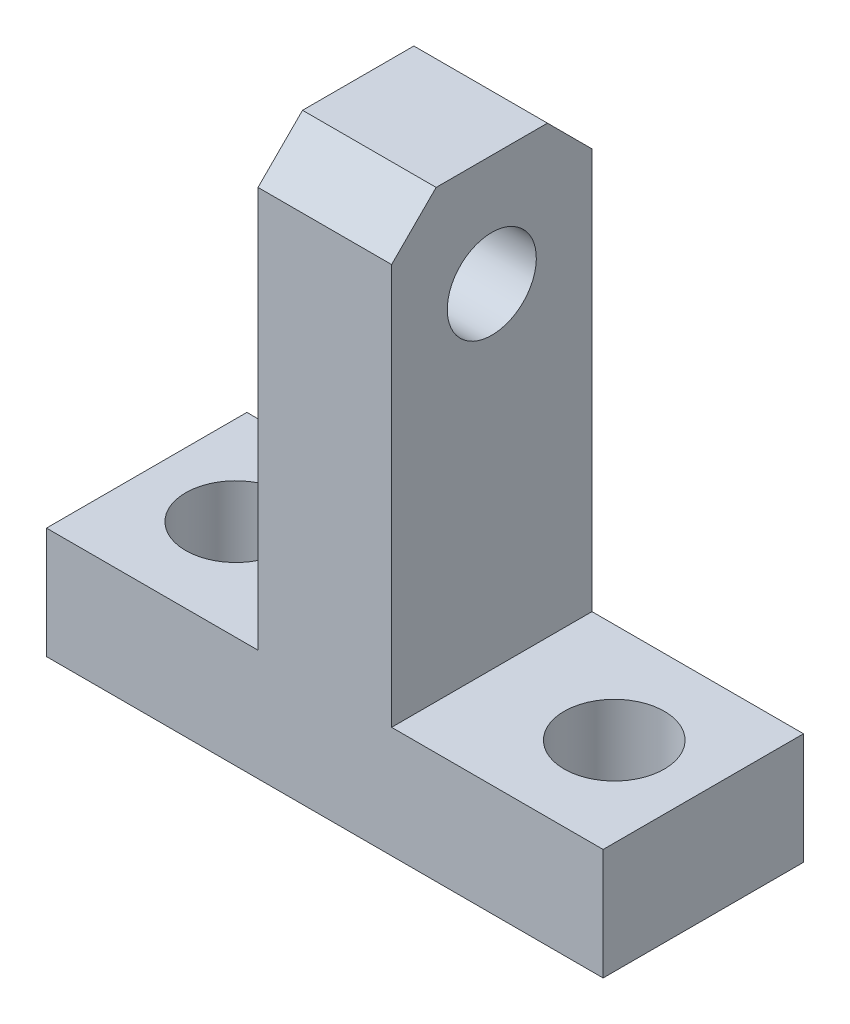
ISO-10303-21;
HEADER;
FILE_DESCRIPTION(('STEP AP214'),'2;1');
FILE_NAME('part.step','',(''),(''),'','','');
FILE_SCHEMA(('AUTOMOTIVE_DESIGN { 1 0 10303 214 1 1 1 1 }'));
ENDSEC;
DATA;
#1=APPLICATION_CONTEXT('core data for automotive mechanical design processes');
#2=APPLICATION_PROTOCOL_DEFINITION('international standard','automotive_design',2000,#1);
#3=PRODUCT_CONTEXT('',#1,'mechanical');
#4=PRODUCT('Part','Part','',(#3));
#5=PRODUCT_RELATED_PRODUCT_CATEGORY('part','',(#4));
#6=PRODUCT_DEFINITION_FORMATION('','',#4);
#7=PRODUCT_DEFINITION_CONTEXT('part definition',#1,'design');
#8=PRODUCT_DEFINITION('design','',#6,#7);
#9=PRODUCT_DEFINITION_SHAPE('','',#8);
#10=(LENGTH_UNIT() NAMED_UNIT(*) SI_UNIT(.MILLI.,.METRE.));
#11=(NAMED_UNIT(*) PLANE_ANGLE_UNIT() SI_UNIT($,.RADIAN.));
#12=(NAMED_UNIT(*) SI_UNIT($,.STERADIAN.) SOLID_ANGLE_UNIT());
#13=UNCERTAINTY_MEASURE_WITH_UNIT(LENGTH_MEASURE(1.E-05),#10,'distance_accuracy_value','');
#14=(GEOMETRIC_REPRESENTATION_CONTEXT(3) GLOBAL_UNCERTAINTY_ASSIGNED_CONTEXT((#13)) GLOBAL_UNIT_ASSIGNED_CONTEXT((#10,
#11,#12)) REPRESENTATION_CONTEXT('',''));
#15=CARTESIAN_POINT('',(0.,0.,0.));
#16=DIRECTION('',(0.,0.,1.));
#17=DIRECTION('',(1.,0.,0.));
#18=AXIS2_PLACEMENT_3D('',#15,#16,#17);
#19=CARTESIAN_POINT('',(3.,5.,4.5));
#20=DIRECTION('',(0.,-1.,0.));
#21=DIRECTION('',(1.,0.,0.));
#22=AXIS2_PLACEMENT_3D('',#19,#20,#21);
#23=PLANE('',#22);
#24=DIRECTION('',(-1.,0.,0.));
#25=VECTOR('',#24,1.);
#26=CARTESIAN_POINT('',(3.,5.,-4.5));
#27=LINE('',#26,#25);
#28=CARTESIAN_POINT('',(12.5,5.,-4.5));
#29=VERTEX_POINT('',#28);
#30=CARTESIAN_POINT('',(3.,5.,-4.5));
#31=VERTEX_POINT('',#30);
#32=EDGE_CURVE('E182',#29,#31,#27,.T.);
#33=ORIENTED_EDGE('',*,*,#32,.T.);
#34=DIRECTION('',(0.,0.,-1.));
#35=VECTOR('',#34,1.);
#36=CARTESIAN_POINT('',(3.,5.,4.5));
#37=LINE('',#36,#35);
#38=CARTESIAN_POINT('',(3.,5.,4.5));
#39=VERTEX_POINT('',#38);
#40=EDGE_CURVE('E169',#39,#31,#37,.T.);
#41=ORIENTED_EDGE('',*,*,#40,.F.);
#42=DIRECTION('',(-1.,0.,0.));
#43=VECTOR('',#42,1.);
#44=CARTESIAN_POINT('',(3.,5.,4.5));
#45=LINE('',#44,#43);
#46=CARTESIAN_POINT('',(12.5,5.,4.5));
#47=VERTEX_POINT('',#46);
#48=EDGE_CURVE('E198',#47,#39,#45,.T.);
#49=ORIENTED_EDGE('',*,*,#48,.F.);
#50=DIRECTION('',(0.,0.,-1.));
#51=VECTOR('',#50,1.);
#52=CARTESIAN_POINT('',(12.5,5.,4.5));
#53=LINE('',#52,#51);
#54=EDGE_CURVE('E144',#47,#29,#53,.T.);
#55=ORIENTED_EDGE('',*,*,#54,.T.);
#56=EDGE_LOOP('',(#33,#41,#49,#55));
#57=FACE_BOUND('',#56,.T.);
#58=CARTESIAN_POINT('',(8.5,5.,0.));
#59=DIRECTION('',(0.,1.,0.));
#60=DIRECTION('',(0.,0.,1.));
#61=AXIS2_PLACEMENT_3D('',#58,#59,#60);
#62=CIRCLE('',#61,2.24999999999999);
#63=CARTESIAN_POINT('',(8.5,5.,2.24999999999999));
#64=VERTEX_POINT('',#63);
#65=EDGE_CURVE('E217',#64,#64,#62,.T.);
#66=ORIENTED_EDGE('',*,*,#65,.F.);
#67=EDGE_LOOP('',(#66));
#68=FACE_BOUND('',#67,.T.);
#69=ADVANCED_FACE('F33',(#57,#68),#23,.F.);
#70=CARTESIAN_POINT('',(-12.5,0.,4.5));
#71=DIRECTION('',(1.,0.,0.));
#72=DIRECTION('',(0.,0.,-1.));
#73=AXIS2_PLACEMENT_3D('',#70,#71,#72);
#74=PLANE('',#73);
#75=DIRECTION('',(0.,-1.,0.));
#76=VECTOR('',#75,1.);
#77=CARTESIAN_POINT('',(-12.5,0.,-4.5));
#78=LINE('',#77,#76);
#79=CARTESIAN_POINT('',(-12.5,5.,-4.5));
#80=VERTEX_POINT('',#79);
#81=CARTESIAN_POINT('',(-12.5,0.,-4.5));
#82=VERTEX_POINT('',#81);
#83=EDGE_CURVE('E139',#80,#82,#78,.T.);
#84=ORIENTED_EDGE('',*,*,#83,.T.);
#85=DIRECTION('',(0.,0.,-1.));
#86=VECTOR('',#85,1.);
#87=CARTESIAN_POINT('',(-12.5,0.,4.5));
#88=LINE('',#87,#86);
#89=CARTESIAN_POINT('',(-12.5,0.,4.5));
#90=VERTEX_POINT('',#89);
#91=EDGE_CURVE('E119',#90,#82,#88,.T.);
#92=ORIENTED_EDGE('',*,*,#91,.F.);
#93=DIRECTION('',(0.,-1.,0.));
#94=VECTOR('',#93,1.);
#95=CARTESIAN_POINT('',(-12.5,0.,4.5));
#96=LINE('',#95,#94);
#97=CARTESIAN_POINT('',(-12.5,5.,4.5));
#98=VERTEX_POINT('',#97);
#99=EDGE_CURVE('E126',#98,#90,#96,.T.);
#100=ORIENTED_EDGE('',*,*,#99,.F.);
#101=DIRECTION('',(0.,0.,-1.));
#102=VECTOR('',#101,1.);
#103=CARTESIAN_POINT('',(-12.5,5.,4.5));
#104=LINE('',#103,#102);
#105=EDGE_CURVE('E186',#98,#80,#104,.T.);
#106=ORIENTED_EDGE('',*,*,#105,.T.);
#107=EDGE_LOOP('',(#84,#92,#100,#106));
#108=FACE_BOUND('',#107,.T.);
#109=ADVANCED_FACE('F137',(#108),#74,.F.);
#110=CARTESIAN_POINT('',(12.5,0.,4.5));
#111=DIRECTION('',(0.,1.,0.));
#112=DIRECTION('',(0.,0.,1.));
#113=AXIS2_PLACEMENT_3D('',#110,#111,#112);
#114=PLANE('',#113);
#115=CARTESIAN_POINT('',(-8.5,0.,0.));
#116=DIRECTION('',(0.,1.,0.));
#117=DIRECTION('',(0.,0.,1.));
#118=AXIS2_PLACEMENT_3D('',#115,#116,#117);
#119=CIRCLE('',#118,2.24999999999999);
#120=CARTESIAN_POINT('',(-8.5,0.,2.24999999999999));
#121=VERTEX_POINT('',#120);
#122=EDGE_CURVE('E220',#121,#121,#119,.T.);
#123=ORIENTED_EDGE('',*,*,#122,.T.);
#124=EDGE_LOOP('',(#123));
#125=FACE_BOUND('',#124,.T.);
#126=CARTESIAN_POINT('',(8.5,0.,0.));
#127=DIRECTION('',(0.,1.,0.));
#128=DIRECTION('',(0.,0.,1.));
#129=AXIS2_PLACEMENT_3D('',#126,#127,#128);
#130=CIRCLE('',#129,2.24999999999999);
#131=CARTESIAN_POINT('',(8.5,0.,2.24999999999999));
#132=VERTEX_POINT('',#131);
#133=EDGE_CURVE('E207',#132,#132,#130,.T.);
#134=ORIENTED_EDGE('',*,*,#133,.T.);
#135=EDGE_LOOP('',(#134));
#136=FACE_BOUND('',#135,.T.);
#137=DIRECTION('',(1.,0.,0.));
#138=VECTOR('',#137,1.);
#139=CARTESIAN_POINT('',(12.5,0.,-4.5));
#140=LINE('',#139,#138);
#141=CARTESIAN_POINT('',(12.5,0.,-4.5));
#142=VERTEX_POINT('',#141);
#143=EDGE_CURVE('E202',#82,#142,#140,.T.);
#144=ORIENTED_EDGE('',*,*,#143,.T.);
#145=DIRECTION('',(0.,0.,-1.));
#146=VECTOR('',#145,1.);
#147=CARTESIAN_POINT('',(12.5,0.,4.5));
#148=LINE('',#147,#146);
#149=CARTESIAN_POINT('',(12.5,0.,4.5));
#150=VERTEX_POINT('',#149);
#151=EDGE_CURVE('E122',#150,#142,#148,.T.);
#152=ORIENTED_EDGE('',*,*,#151,.F.);
#153=DIRECTION('',(1.,0.,0.));
#154=VECTOR('',#153,1.);
#155=CARTESIAN_POINT('',(12.5,0.,4.5));
#156=LINE('',#155,#154);
#157=EDGE_CURVE('E115',#90,#150,#156,.T.);
#158=ORIENTED_EDGE('',*,*,#157,.F.);
#159=ORIENTED_EDGE('',*,*,#91,.T.);
#160=EDGE_LOOP('',(#144,#152,#158,#159));
#161=FACE_BOUND('',#160,.T.);
#162=ADVANCED_FACE('F117',(#125,#136,#161),#114,.F.);
#163=CARTESIAN_POINT('',(12.5,5.,4.5));
#164=DIRECTION('',(-1.,0.,0.));
#165=DIRECTION('',(0.,0.,1.));
#166=AXIS2_PLACEMENT_3D('',#163,#164,#165);
#167=PLANE('',#166);
#168=DIRECTION('',(0.,1.,0.));
#169=VECTOR('',#168,1.);
#170=CARTESIAN_POINT('',(12.5,5.,-4.5));
#171=LINE('',#170,#169);
#172=EDGE_CURVE('E201',#142,#29,#171,.T.);
#173=ORIENTED_EDGE('',*,*,#172,.T.);
#174=ORIENTED_EDGE('',*,*,#54,.F.);
#175=DIRECTION('',(0.,1.,0.));
#176=VECTOR('',#175,1.);
#177=CARTESIAN_POINT('',(12.5,5.,4.5));
#178=LINE('',#177,#176);
#179=EDGE_CURVE('E125',#150,#47,#178,.T.);
#180=ORIENTED_EDGE('',*,*,#179,.F.);
#181=ORIENTED_EDGE('',*,*,#151,.T.);
#182=EDGE_LOOP('',(#173,#174,#180,#181));
#183=FACE_BOUND('',#182,.T.);
#184=ADVANCED_FACE('F251',(#183),#167,.F.);
#185=CARTESIAN_POINT('',(3.,25.,4.5));
#186=DIRECTION('',(-1.,0.,0.));
#187=DIRECTION('',(0.,-1.,0.));
#188=AXIS2_PLACEMENT_3D('',#185,#186,#187);
#189=PLANE('',#188);
#190=CARTESIAN_POINT('',(3.,20.,0.));
#191=DIRECTION('',(1.,0.,0.));
#192=DIRECTION('',(0.,1.,0.));
#193=AXIS2_PLACEMENT_3D('',#190,#191,#192);
#194=CIRCLE('',#193,2.);
#195=CARTESIAN_POINT('',(3.,22.,0.));
#196=VERTEX_POINT('',#195);
#197=EDGE_CURVE('E226',#196,#196,#194,.T.);
#198=ORIENTED_EDGE('',*,*,#197,.F.);
#199=EDGE_LOOP('',(#198));
#200=FACE_BOUND('',#199,.T.);
#201=DIRECTION('',(0.,1.,0.));
#202=VECTOR('',#201,1.);
#203=CARTESIAN_POINT('',(3.,25.,-4.5));
#204=LINE('',#203,#202);
#205=CARTESIAN_POINT('',(3.,23.,-4.5));
#206=VERTEX_POINT('',#205);
#207=EDGE_CURVE('E161',#31,#206,#204,.T.);
#208=ORIENTED_EDGE('',*,*,#207,.T.);
#209=DIRECTION('',(0.,0.707106781186549,0.707106781186546));
#210=VECTOR('',#209,1.);
#211=CARTESIAN_POINT('',(3.,25.,-2.5));
#212=LINE('',#211,#210);
#213=CARTESIAN_POINT('',(3.,25.,-2.5));
#214=VERTEX_POINT('',#213);
#215=EDGE_CURVE('E42',#206,#214,#212,.T.);
#216=ORIENTED_EDGE('',*,*,#215,.T.);
#217=DIRECTION('',(0.,0.,-1.));
#218=VECTOR('',#217,1.);
#219=CARTESIAN_POINT('',(3.,25.,4.5));
#220=LINE('',#219,#218);
#221=CARTESIAN_POINT('',(3.,25.,2.49999999999999));
#222=VERTEX_POINT('',#221);
#223=EDGE_CURVE('E159',#222,#214,#220,.T.);
#224=ORIENTED_EDGE('',*,*,#223,.F.);
#225=DIRECTION('',(0.,0.707106781186546,-0.707106781186549));
#226=VECTOR('',#225,1.);
#227=CARTESIAN_POINT('',(3.,23.,4.5));
#228=LINE('',#227,#226);
#229=CARTESIAN_POINT('',(3.,23.,4.5));
#230=VERTEX_POINT('',#229);
#231=EDGE_CURVE('E49',#222,#230,#228,.F.);
#232=ORIENTED_EDGE('',*,*,#231,.T.);
#233=DIRECTION('',(0.,1.,0.));
#234=VECTOR('',#233,1.);
#235=CARTESIAN_POINT('',(3.,25.,4.5));
#236=LINE('',#235,#234);
#237=EDGE_CURVE('E211',#39,#230,#236,.T.);
#238=ORIENTED_EDGE('',*,*,#237,.F.);
#239=ORIENTED_EDGE('',*,*,#40,.T.);
#240=EDGE_LOOP('',(#208,#216,#224,#232,#238,#239));
#241=FACE_BOUND('',#240,.T.);
#242=ADVANCED_FACE('F158',(#200,#241),#189,.F.);
#243=CARTESIAN_POINT('',(-3.,25.,4.5));
#244=DIRECTION('',(0.,-1.,0.));
#245=DIRECTION('',(0.,0.,-1.));
#246=AXIS2_PLACEMENT_3D('',#243,#244,#245);
#247=PLANE('',#246);
#248=ORIENTED_EDGE('',*,*,#223,.T.);
#249=DIRECTION('',(-1.,0.,0.));
#250=VECTOR('',#249,1.);
#251=CARTESIAN_POINT('',(-3.,25.,-2.5));
#252=LINE('',#251,#250);
#253=CARTESIAN_POINT('',(-3.,25.,-2.5));
#254=VERTEX_POINT('',#253);
#255=EDGE_CURVE('E142',#214,#254,#252,.T.);
#256=ORIENTED_EDGE('',*,*,#255,.T.);
#257=DIRECTION('',(0.,0.,-1.));
#258=VECTOR('',#257,1.);
#259=CARTESIAN_POINT('',(-3.,25.,4.5));
#260=LINE('',#259,#258);
#261=CARTESIAN_POINT('',(-3.,25.,2.49999999999999));
#262=VERTEX_POINT('',#261);
#263=EDGE_CURVE('E170',#262,#254,#260,.T.);
#264=ORIENTED_EDGE('',*,*,#263,.F.);
#265=DIRECTION('',(1.,0.,0.));
#266=VECTOR('',#265,1.);
#267=CARTESIAN_POINT('',(-3.,25.,2.49999999999999));
#268=LINE('',#267,#266);
#269=EDGE_CURVE('E140',#262,#222,#268,.T.);
#270=ORIENTED_EDGE('',*,*,#269,.T.);
#271=EDGE_LOOP('',(#248,#256,#264,#270));
#272=FACE_BOUND('',#271,.T.);
#273=ADVANCED_FACE('F165',(#272),#247,.F.);
#274=CARTESIAN_POINT('',(-3.,5.,4.5));
#275=DIRECTION('',(1.,0.,0.));
#276=DIRECTION('',(0.,1.,0.));
#277=AXIS2_PLACEMENT_3D('',#274,#275,#276);
#278=PLANE('',#277);
#279=CARTESIAN_POINT('',(-3.,20.,0.));
#280=DIRECTION('',(1.,0.,0.));
#281=DIRECTION('',(0.,1.,0.));
#282=AXIS2_PLACEMENT_3D('',#279,#280,#281);
#283=CIRCLE('',#282,2.);
#284=CARTESIAN_POINT('',(-3.,22.,0.));
#285=VERTEX_POINT('',#284);
#286=EDGE_CURVE('E37',#285,#285,#283,.T.);
#287=ORIENTED_EDGE('',*,*,#286,.T.);
#288=EDGE_LOOP('',(#287));
#289=FACE_BOUND('',#288,.T.);
#290=ORIENTED_EDGE('',*,*,#263,.T.);
#291=DIRECTION('',(0.,-0.707106781186549,-0.707106781186546));
#292=VECTOR('',#291,1.);
#293=CARTESIAN_POINT('',(-3.,25.,-2.5));
#294=LINE('',#293,#292);
#295=CARTESIAN_POINT('',(-3.,23.,-4.5));
#296=VERTEX_POINT('',#295);
#297=EDGE_CURVE('E152',#254,#296,#294,.T.);
#298=ORIENTED_EDGE('',*,*,#297,.T.);
#299=DIRECTION('',(0.,-1.,0.));
#300=VECTOR('',#299,1.);
#301=CARTESIAN_POINT('',(-3.,5.,-4.5));
#302=LINE('',#301,#300);
#303=CARTESIAN_POINT('',(-3.,5.,-4.5));
#304=VERTEX_POINT('',#303);
#305=EDGE_CURVE('E176',#296,#304,#302,.T.);
#306=ORIENTED_EDGE('',*,*,#305,.T.);
#307=DIRECTION('',(0.,0.,-1.));
#308=VECTOR('',#307,1.);
#309=CARTESIAN_POINT('',(-3.,5.,4.5));
#310=LINE('',#309,#308);
#311=CARTESIAN_POINT('',(-3.,5.,4.5));
#312=VERTEX_POINT('',#311);
#313=EDGE_CURVE('E188',#312,#304,#310,.T.);
#314=ORIENTED_EDGE('',*,*,#313,.F.);
#315=DIRECTION('',(0.,-1.,0.));
#316=VECTOR('',#315,1.);
#317=CARTESIAN_POINT('',(-3.,5.,4.5));
#318=LINE('',#317,#316);
#319=CARTESIAN_POINT('',(-3.,23.,4.5));
#320=VERTEX_POINT('',#319);
#321=EDGE_CURVE('E209',#320,#312,#318,.T.);
#322=ORIENTED_EDGE('',*,*,#321,.F.);
#323=DIRECTION('',(0.,-0.707106781186546,0.707106781186549));
#324=VECTOR('',#323,1.);
#325=CARTESIAN_POINT('',(-3.,23.,4.5));
#326=LINE('',#325,#324);
#327=EDGE_CURVE('E150',#320,#262,#326,.F.);
#328=ORIENTED_EDGE('',*,*,#327,.T.);
#329=EDGE_LOOP('',(#290,#298,#306,#314,#322,#328));
#330=FACE_BOUND('',#329,.T.);
#331=ADVANCED_FACE('F174',(#289,#330),#278,.F.);
#332=CARTESIAN_POINT('',(-12.5,5.,4.5));
#333=DIRECTION('',(0.,-1.,0.));
#334=DIRECTION('',(1.,0.,0.));
#335=AXIS2_PLACEMENT_3D('',#332,#333,#334);
#336=PLANE('',#335);
#337=CARTESIAN_POINT('',(-8.5,5.,0.));
#338=DIRECTION('',(0.,1.,0.));
#339=DIRECTION('',(0.,0.,1.));
#340=AXIS2_PLACEMENT_3D('',#337,#338,#339);
#341=CIRCLE('',#340,2.24999999999999);
#342=CARTESIAN_POINT('',(-8.5,5.,2.24999999999999));
#343=VERTEX_POINT('',#342);
#344=EDGE_CURVE('E223',#343,#343,#341,.T.);
#345=ORIENTED_EDGE('',*,*,#344,.F.);
#346=EDGE_LOOP('',(#345));
#347=FACE_BOUND('',#346,.T.);
#348=DIRECTION('',(-1.,0.,0.));
#349=VECTOR('',#348,1.);
#350=CARTESIAN_POINT('',(-12.5,5.,-4.5));
#351=LINE('',#350,#349);
#352=EDGE_CURVE('E135',#304,#80,#351,.T.);
#353=ORIENTED_EDGE('',*,*,#352,.T.);
#354=ORIENTED_EDGE('',*,*,#105,.F.);
#355=DIRECTION('',(-1.,0.,0.));
#356=VECTOR('',#355,1.);
#357=CARTESIAN_POINT('',(-12.5,5.,4.5));
#358=LINE('',#357,#356);
#359=EDGE_CURVE('E131',#312,#98,#358,.T.);
#360=ORIENTED_EDGE('',*,*,#359,.F.);
#361=ORIENTED_EDGE('',*,*,#313,.T.);
#362=EDGE_LOOP('',(#353,#354,#360,#361));
#363=FACE_BOUND('',#362,.T.);
#364=ADVANCED_FACE('F273',(#347,#363),#336,.F.);
#365=CARTESIAN_POINT('',(0.,0.,4.5));
#366=DIRECTION('',(0.,0.,-1.));
#367=DIRECTION('',(-1.,0.,0.));
#368=AXIS2_PLACEMENT_3D('',#365,#366,#367);
#369=PLANE('',#368);
#370=ORIENTED_EDGE('',*,*,#237,.T.);
#371=DIRECTION('',(-1.,0.,0.));
#372=VECTOR('',#371,1.);
#373=CARTESIAN_POINT('',(0.,23.,4.5));
#374=LINE('',#373,#372);
#375=EDGE_CURVE('E11',#230,#320,#374,.T.);
#376=ORIENTED_EDGE('',*,*,#375,.T.);
#377=ORIENTED_EDGE('',*,*,#321,.T.);
#378=ORIENTED_EDGE('',*,*,#359,.T.);
#379=ORIENTED_EDGE('',*,*,#99,.T.);
#380=ORIENTED_EDGE('',*,*,#157,.T.);
#381=ORIENTED_EDGE('',*,*,#179,.T.);
#382=ORIENTED_EDGE('',*,*,#48,.T.);
#383=EDGE_LOOP('',(#370,#376,#377,#378,#379,#380,#381,#382));
#384=FACE_BOUND('',#383,.T.);
#385=ADVANCED_FACE('F129',(#384),#369,.F.);
#386=CARTESIAN_POINT('',(0.,0.,-4.5));
#387=DIRECTION('',(0.,0.,-1.));
#388=DIRECTION('',(-1.,0.,0.));
#389=AXIS2_PLACEMENT_3D('',#386,#387,#388);
#390=PLANE('',#389);
#391=ORIENTED_EDGE('',*,*,#305,.F.);
#392=DIRECTION('',(1.,0.,0.));
#393=VECTOR('',#392,1.);
#394=CARTESIAN_POINT('',(3.,23.,-4.5));
#395=LINE('',#394,#393);
#396=EDGE_CURVE('E57',#296,#206,#395,.T.);
#397=ORIENTED_EDGE('',*,*,#396,.T.);
#398=ORIENTED_EDGE('',*,*,#207,.F.);
#399=ORIENTED_EDGE('',*,*,#32,.F.);
#400=ORIENTED_EDGE('',*,*,#172,.F.);
#401=ORIENTED_EDGE('',*,*,#143,.F.);
#402=ORIENTED_EDGE('',*,*,#83,.F.);
#403=ORIENTED_EDGE('',*,*,#352,.F.);
#404=EDGE_LOOP('',(#391,#397,#398,#399,#400,#401,#402,#403));
#405=FACE_BOUND('',#404,.T.);
#406=ADVANCED_FACE('F179',(#405),#390,.T.);
#407=CARTESIAN_POINT('',(8.5,5.,0.));
#408=DIRECTION('',(0.,1.,0.));
#409=DIRECTION('',(0.,0.,1.));
#410=AXIS2_PLACEMENT_3D('',#407,#408,#409);
#411=CYLINDRICAL_SURFACE('',#410,2.24999999999999);
#412=ORIENTED_EDGE('',*,*,#133,.F.);
#413=EDGE_LOOP('',(#412));
#414=FACE_BOUND('',#413,.T.);
#415=ORIENTED_EDGE('',*,*,#65,.T.);
#416=EDGE_LOOP('',(#415));
#417=FACE_BOUND('',#416,.T.);
#418=ADVANCED_FACE('F261',(#414,#417),#411,.F.);
#419=CARTESIAN_POINT('',(-8.5,5.,0.));
#420=DIRECTION('',(0.,1.,0.));
#421=DIRECTION('',(0.,0.,1.));
#422=AXIS2_PLACEMENT_3D('',#419,#420,#421);
#423=CYLINDRICAL_SURFACE('',#422,2.24999999999999);
#424=ORIENTED_EDGE('',*,*,#122,.F.);
#425=EDGE_LOOP('',(#424));
#426=FACE_BOUND('',#425,.T.);
#427=ORIENTED_EDGE('',*,*,#344,.T.);
#428=EDGE_LOOP('',(#427));
#429=FACE_BOUND('',#428,.T.);
#430=ADVANCED_FACE('F257',(#426,#429),#423,.F.);
#431=CARTESIAN_POINT('',(-3.,25.,-2.5));
#432=DIRECTION('',(0.,0.707106781186546,-0.707106781186549));
#433=DIRECTION('',(1.,0.,0.));
#434=AXIS2_PLACEMENT_3D('',#431,#432,#433);
#435=PLANE('',#434);
#436=ORIENTED_EDGE('',*,*,#215,.F.);
#437=ORIENTED_EDGE('',*,*,#396,.F.);
#438=ORIENTED_EDGE('',*,*,#297,.F.);
#439=ORIENTED_EDGE('',*,*,#255,.F.);
#440=EDGE_LOOP('',(#436,#437,#438,#439));
#441=FACE_BOUND('',#440,.T.);
#442=ADVANCED_FACE('F172',(#441),#435,.T.);
#443=CARTESIAN_POINT('',(0.,23.,4.5));
#444=DIRECTION('',(0.,-0.707106781186549,-0.707106781186546));
#445=DIRECTION('',(-1.,0.,0.));
#446=AXIS2_PLACEMENT_3D('',#443,#444,#445);
#447=PLANE('',#446);
#448=ORIENTED_EDGE('',*,*,#231,.F.);
#449=ORIENTED_EDGE('',*,*,#269,.F.);
#450=ORIENTED_EDGE('',*,*,#327,.F.);
#451=ORIENTED_EDGE('',*,*,#375,.F.);
#452=EDGE_LOOP('',(#448,#449,#450,#451));
#453=FACE_BOUND('',#452,.T.);
#454=ADVANCED_FACE('F35',(#453),#447,.F.);
#455=CARTESIAN_POINT('',(-12.5,20.,0.));
#456=DIRECTION('',(1.,0.,0.));
#457=DIRECTION('',(0.,1.,0.));
#458=AXIS2_PLACEMENT_3D('',#455,#456,#457);
#459=CYLINDRICAL_SURFACE('',#458,2.);
#460=ORIENTED_EDGE('',*,*,#197,.T.);
#461=EDGE_LOOP('',(#460));
#462=FACE_BOUND('',#461,.T.);
#463=ORIENTED_EDGE('',*,*,#286,.F.);
#464=EDGE_LOOP('',(#463));
#465=FACE_BOUND('',#464,.T.);
#466=ADVANCED_FACE('F234',(#462,#465),#459,.F.);
#467=CLOSED_SHELL('',(#69,#109,#162,#184,#242,#273,#331,#364,#385,#406,#418,#430,#442,#454,#466));
#468=MANIFOLD_SOLID_BREP('B2',#467);
#469=ADVANCED_BREP_SHAPE_REPRESENTATION('',(#18,#468),#14);
#470=SHAPE_DEFINITION_REPRESENTATION(#9,#469);
ENDSEC;
END-ISO-10303-21;
